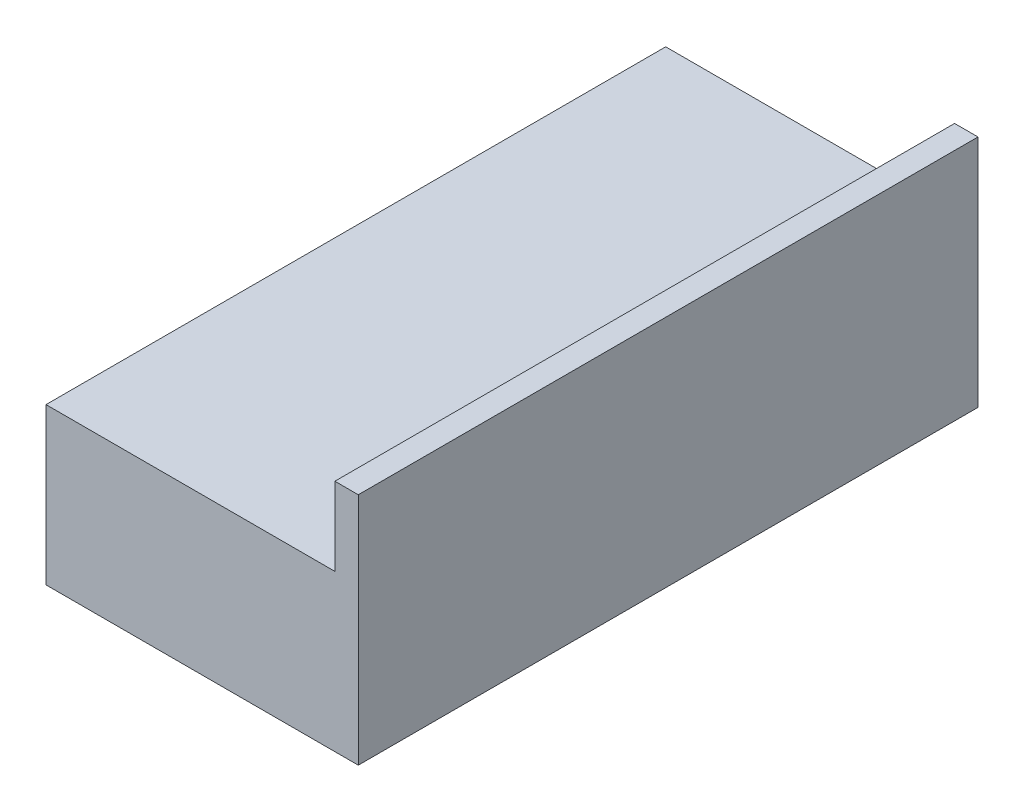
ISO-10303-21;
HEADER;
FILE_DESCRIPTION(('STEP AP214'),'2;1');
FILE_NAME('part.step','',(''),(''),'','','');
FILE_SCHEMA(('AUTOMOTIVE_DESIGN { 1 0 10303 214 1 1 1 1 }'));
ENDSEC;
DATA;
#1=APPLICATION_CONTEXT('core data for automotive mechanical design processes');
#2=APPLICATION_PROTOCOL_DEFINITION('international standard','automotive_design',2000,#1);
#3=PRODUCT_CONTEXT('',#1,'mechanical');
#4=PRODUCT('Part','Part','',(#3));
#5=PRODUCT_RELATED_PRODUCT_CATEGORY('part','',(#4));
#6=PRODUCT_DEFINITION_FORMATION('','',#4);
#7=PRODUCT_DEFINITION_CONTEXT('part definition',#1,'design');
#8=PRODUCT_DEFINITION('design','',#6,#7);
#9=PRODUCT_DEFINITION_SHAPE('','',#8);
#10=(LENGTH_UNIT() NAMED_UNIT(*) SI_UNIT(.MILLI.,.METRE.));
#11=(NAMED_UNIT(*) PLANE_ANGLE_UNIT() SI_UNIT($,.RADIAN.));
#12=(NAMED_UNIT(*) SI_UNIT($,.STERADIAN.) SOLID_ANGLE_UNIT());
#13=UNCERTAINTY_MEASURE_WITH_UNIT(LENGTH_MEASURE(1.E-05),#10,'distance_accuracy_value','');
#14=(GEOMETRIC_REPRESENTATION_CONTEXT(3) GLOBAL_UNCERTAINTY_ASSIGNED_CONTEXT((#13)) GLOBAL_UNIT_ASSIGNED_CONTEXT((#10,
#11,#12)) REPRESENTATION_CONTEXT('',''));
#15=CARTESIAN_POINT('',(0.,0.,0.));
#16=DIRECTION('',(0.,0.,1.));
#17=DIRECTION('',(1.,0.,0.));
#18=AXIS2_PLACEMENT_3D('',#15,#16,#17);
#19=CARTESIAN_POINT('',(-20.,-10.,-39.6875));
#20=DIRECTION('',(0.,-1.,0.));
#21=DIRECTION('',(0.,0.,-1.));
#22=AXIS2_PLACEMENT_3D('',#19,#20,#21);
#23=PLANE('',#22);
#24=DIRECTION('',(0.,0.,1.));
#25=VECTOR('',#24,1.);
#26=CARTESIAN_POINT('',(20.,-10.,-39.6875));
#27=LINE('',#26,#25);
#28=CARTESIAN_POINT('',(20.,-10.,-39.6875));
#29=VERTEX_POINT('',#28);
#30=CARTESIAN_POINT('',(20.,-10.,39.6875));
#31=VERTEX_POINT('',#30);
#32=EDGE_CURVE('E11',#29,#31,#27,.T.);
#33=ORIENTED_EDGE('',*,*,#32,.T.);
#34=DIRECTION('',(1.,0.,0.));
#35=VECTOR('',#34,1.);
#36=CARTESIAN_POINT('',(-20.,-10.,39.6875));
#37=LINE('',#36,#35);
#38=CARTESIAN_POINT('',(-20.,-10.,39.6875));
#39=VERTEX_POINT('',#38);
#40=EDGE_CURVE('E101',#39,#31,#37,.T.);
#41=ORIENTED_EDGE('',*,*,#40,.F.);
#42=DIRECTION('',(0.,0.,1.));
#43=VECTOR('',#42,1.);
#44=CARTESIAN_POINT('',(-20.,-10.,-39.6875));
#45=LINE('',#44,#43);
#46=CARTESIAN_POINT('',(-20.,-10.,-39.6875));
#47=VERTEX_POINT('',#46);
#48=EDGE_CURVE('E42',#47,#39,#45,.T.);
#49=ORIENTED_EDGE('',*,*,#48,.F.);
#50=DIRECTION('',(1.,0.,0.));
#51=VECTOR('',#50,1.);
#52=CARTESIAN_POINT('',(-20.,-10.,-39.6875));
#53=LINE('',#52,#51);
#54=EDGE_CURVE('E92',#47,#29,#53,.T.);
#55=ORIENTED_EDGE('',*,*,#54,.T.);
#56=EDGE_LOOP('',(#33,#41,#49,#55));
#57=FACE_BOUND('',#56,.T.);
#58=ADVANCED_FACE('F33',(#57),#23,.T.);
#59=CARTESIAN_POINT('',(-20.,10.,-39.6875));
#60=DIRECTION('',(-1.,0.,0.));
#61=DIRECTION('',(0.,0.,1.));
#62=AXIS2_PLACEMENT_3D('',#59,#60,#61);
#63=PLANE('',#62);
#64=ORIENTED_EDGE('',*,*,#48,.T.);
#65=DIRECTION('',(0.,-1.,0.));
#66=VECTOR('',#65,1.);
#67=CARTESIAN_POINT('',(-20.,10.,39.6875));
#68=LINE('',#67,#66);
#69=CARTESIAN_POINT('',(-20.,10.,39.6875));
#70=VERTEX_POINT('',#69);
#71=EDGE_CURVE('E111',#70,#39,#68,.T.);
#72=ORIENTED_EDGE('',*,*,#71,.F.);
#73=DIRECTION('',(0.,0.,1.));
#74=VECTOR('',#73,1.);
#75=CARTESIAN_POINT('',(-20.,10.,-39.6875));
#76=LINE('',#75,#74);
#77=CARTESIAN_POINT('',(-20.,10.,-39.6875));
#78=VERTEX_POINT('',#77);
#79=EDGE_CURVE('E127',#78,#70,#76,.T.);
#80=ORIENTED_EDGE('',*,*,#79,.F.);
#81=DIRECTION('',(0.,-1.,0.));
#82=VECTOR('',#81,1.);
#83=CARTESIAN_POINT('',(-20.,10.,-39.6875));
#84=LINE('',#83,#82);
#85=EDGE_CURVE('E123',#78,#47,#84,.T.);
#86=ORIENTED_EDGE('',*,*,#85,.T.);
#87=EDGE_LOOP('',(#64,#72,#80,#86));
#88=FACE_BOUND('',#87,.T.);
#89=ADVANCED_FACE('F140',(#88),#63,.T.);
#90=CARTESIAN_POINT('',(-20.,10.,-39.6875));
#91=DIRECTION('',(0.,1.,0.));
#92=DIRECTION('',(0.,0.,1.));
#93=AXIS2_PLACEMENT_3D('',#90,#91,#92);
#94=PLANE('',#93);
#95=ORIENTED_EDGE('',*,*,#79,.T.);
#96=DIRECTION('',(-1.,0.,0.));
#97=VECTOR('',#96,1.);
#98=CARTESIAN_POINT('',(-20.,10.,39.6875));
#99=LINE('',#98,#97);
#100=CARTESIAN_POINT('',(17.,10.,39.6875));
#101=VERTEX_POINT('',#100);
#102=EDGE_CURVE('E106',#101,#70,#99,.T.);
#103=ORIENTED_EDGE('',*,*,#102,.F.);
#104=DIRECTION('',(0.,0.,1.));
#105=VECTOR('',#104,1.);
#106=CARTESIAN_POINT('',(17.,10.,-39.6875));
#107=LINE('',#106,#105);
#108=CARTESIAN_POINT('',(17.,10.,-39.6875));
#109=VERTEX_POINT('',#108);
#110=EDGE_CURVE('E129',#109,#101,#107,.T.);
#111=ORIENTED_EDGE('',*,*,#110,.F.);
#112=DIRECTION('',(-1.,0.,0.));
#113=VECTOR('',#112,1.);
#114=CARTESIAN_POINT('',(-20.,10.,-39.6875));
#115=LINE('',#114,#113);
#116=EDGE_CURVE('E120',#109,#78,#115,.T.);
#117=ORIENTED_EDGE('',*,*,#116,.T.);
#118=EDGE_LOOP('',(#95,#103,#111,#117));
#119=FACE_BOUND('',#118,.T.);
#120=ADVANCED_FACE('F137',(#119),#94,.T.);
#121=CARTESIAN_POINT('',(17.,10.,-39.6875));
#122=DIRECTION('',(-1.,0.,0.));
#123=DIRECTION('',(0.,0.,1.));
#124=AXIS2_PLACEMENT_3D('',#121,#122,#123);
#125=PLANE('',#124);
#126=ORIENTED_EDGE('',*,*,#110,.T.);
#127=DIRECTION('',(0.,-1.,0.));
#128=VECTOR('',#127,1.);
#129=CARTESIAN_POINT('',(17.,10.,39.6875));
#130=LINE('',#129,#128);
#131=CARTESIAN_POINT('',(17.,20.,39.6875));
#132=VERTEX_POINT('',#131);
#133=EDGE_CURVE('E104',#132,#101,#130,.T.);
#134=ORIENTED_EDGE('',*,*,#133,.F.);
#135=DIRECTION('',(0.,0.,1.));
#136=VECTOR('',#135,1.);
#137=CARTESIAN_POINT('',(17.,20.,-39.6875));
#138=LINE('',#137,#136);
#139=CARTESIAN_POINT('',(17.,20.,-39.6875));
#140=VERTEX_POINT('',#139);
#141=EDGE_CURVE('E91',#140,#132,#138,.T.);
#142=ORIENTED_EDGE('',*,*,#141,.F.);
#143=DIRECTION('',(0.,-1.,0.));
#144=VECTOR('',#143,1.);
#145=CARTESIAN_POINT('',(17.,10.,-39.6875));
#146=LINE('',#145,#144);
#147=EDGE_CURVE('E117',#140,#109,#146,.T.);
#148=ORIENTED_EDGE('',*,*,#147,.T.);
#149=EDGE_LOOP('',(#126,#134,#142,#148));
#150=FACE_BOUND('',#149,.T.);
#151=ADVANCED_FACE('F131',(#150),#125,.T.);
#152=CARTESIAN_POINT('',(20.,20.,-39.6875));
#153=DIRECTION('',(0.,1.,0.));
#154=DIRECTION('',(0.,0.,1.));
#155=AXIS2_PLACEMENT_3D('',#152,#153,#154);
#156=PLANE('',#155);
#157=ORIENTED_EDGE('',*,*,#141,.T.);
#158=DIRECTION('',(-1.,0.,0.));
#159=VECTOR('',#158,1.);
#160=CARTESIAN_POINT('',(20.,20.,39.6875));
#161=LINE('',#160,#159);
#162=CARTESIAN_POINT('',(20.,20.,39.6875));
#163=VERTEX_POINT('',#162);
#164=EDGE_CURVE('E98',#163,#132,#161,.T.);
#165=ORIENTED_EDGE('',*,*,#164,.F.);
#166=DIRECTION('',(0.,0.,1.));
#167=VECTOR('',#166,1.);
#168=CARTESIAN_POINT('',(20.,20.,-39.6875));
#169=LINE('',#168,#167);
#170=CARTESIAN_POINT('',(20.,20.,-39.6875));
#171=VERTEX_POINT('',#170);
#172=EDGE_CURVE('E37',#171,#163,#169,.T.);
#173=ORIENTED_EDGE('',*,*,#172,.F.);
#174=DIRECTION('',(-1.,0.,0.));
#175=VECTOR('',#174,1.);
#176=CARTESIAN_POINT('',(20.,20.,-39.6875));
#177=LINE('',#176,#175);
#178=EDGE_CURVE('E115',#171,#140,#177,.T.);
#179=ORIENTED_EDGE('',*,*,#178,.T.);
#180=EDGE_LOOP('',(#157,#165,#173,#179));
#181=FACE_BOUND('',#180,.T.);
#182=ADVANCED_FACE('F103',(#181),#156,.T.);
#183=CARTESIAN_POINT('',(20.,10.,-39.6875));
#184=DIRECTION('',(1.,0.,0.));
#185=DIRECTION('',(0.,0.,-1.));
#186=AXIS2_PLACEMENT_3D('',#183,#184,#185);
#187=PLANE('',#186);
#188=ORIENTED_EDGE('',*,*,#172,.T.);
#189=DIRECTION('',(0.,1.,0.));
#190=VECTOR('',#189,1.);
#191=CARTESIAN_POINT('',(20.,10.,39.6875));
#192=LINE('',#191,#190);
#193=EDGE_CURVE('E85',#31,#163,#192,.T.);
#194=ORIENTED_EDGE('',*,*,#193,.F.);
#195=ORIENTED_EDGE('',*,*,#32,.F.);
#196=DIRECTION('',(0.,1.,0.));
#197=VECTOR('',#196,1.);
#198=CARTESIAN_POINT('',(20.,10.,-39.6875));
#199=LINE('',#198,#197);
#200=EDGE_CURVE('E86',#29,#171,#199,.T.);
#201=ORIENTED_EDGE('',*,*,#200,.T.);
#202=EDGE_LOOP('',(#188,#194,#195,#201));
#203=FACE_BOUND('',#202,.T.);
#204=ADVANCED_FACE('F35',(#203),#187,.T.);
#205=CARTESIAN_POINT('',(0.,0.,-39.6875));
#206=DIRECTION('',(0.,0.,1.));
#207=DIRECTION('',(1.,0.,0.));
#208=AXIS2_PLACEMENT_3D('',#205,#206,#207);
#209=PLANE('',#208);
#210=ORIENTED_EDGE('',*,*,#200,.F.);
#211=ORIENTED_EDGE('',*,*,#54,.F.);
#212=ORIENTED_EDGE('',*,*,#85,.F.);
#213=ORIENTED_EDGE('',*,*,#116,.F.);
#214=ORIENTED_EDGE('',*,*,#147,.F.);
#215=ORIENTED_EDGE('',*,*,#178,.F.);
#216=EDGE_LOOP('',(#210,#211,#212,#213,#214,#215));
#217=FACE_BOUND('',#216,.T.);
#218=ADVANCED_FACE('F143',(#217),#209,.F.);
#219=CARTESIAN_POINT('',(0.,0.,39.6875));
#220=DIRECTION('',(0.,0.,1.));
#221=DIRECTION('',(1.,0.,0.));
#222=AXIS2_PLACEMENT_3D('',#219,#220,#221);
#223=PLANE('',#222);
#224=ORIENTED_EDGE('',*,*,#193,.T.);
#225=ORIENTED_EDGE('',*,*,#164,.T.);
#226=ORIENTED_EDGE('',*,*,#133,.T.);
#227=ORIENTED_EDGE('',*,*,#102,.T.);
#228=ORIENTED_EDGE('',*,*,#71,.T.);
#229=ORIENTED_EDGE('',*,*,#40,.T.);
#230=EDGE_LOOP('',(#224,#225,#226,#227,#228,#229));
#231=FACE_BOUND('',#230,.T.);
#232=ADVANCED_FACE('F96',(#231),#223,.T.);
#233=CLOSED_SHELL('',(#58,#89,#120,#151,#182,#204,#218,#232));
#234=MANIFOLD_SOLID_BREP('B2',#233);
#235=ADVANCED_BREP_SHAPE_REPRESENTATION('',(#18,#234),#14);
#236=SHAPE_DEFINITION_REPRESENTATION(#9,#235);
ENDSEC;
END-ISO-10303-21;
